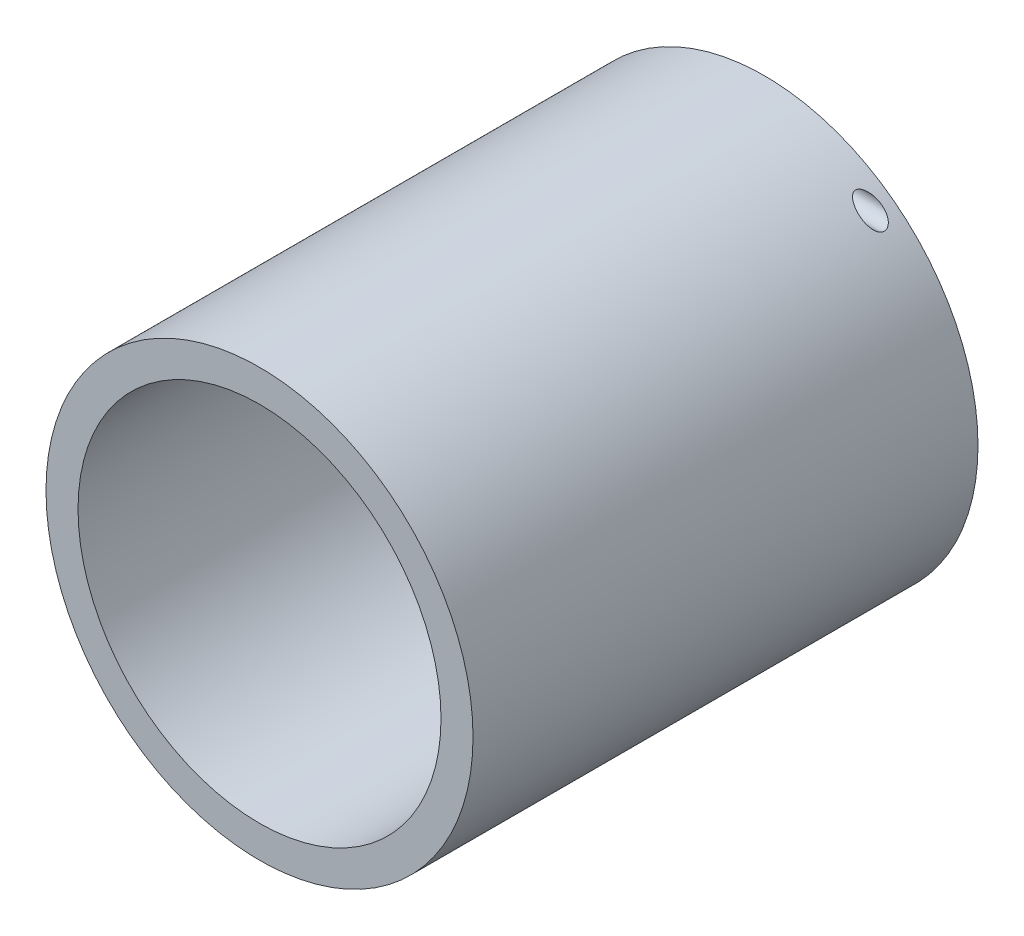
ISO-10303-21;
HEADER;
FILE_DESCRIPTION(('STEP AP214'),'2;1');
FILE_NAME('part.step','',(''),(''),'','','');
FILE_SCHEMA(('AUTOMOTIVE_DESIGN { 1 0 10303 214 1 1 1 1 }'));
ENDSEC;
DATA;
#1=APPLICATION_CONTEXT('core data for automotive mechanical design processes');
#2=APPLICATION_PROTOCOL_DEFINITION('international standard','automotive_design',2000,#1);
#3=PRODUCT_CONTEXT('',#1,'mechanical');
#4=PRODUCT('Part','Part','',(#3));
#5=PRODUCT_RELATED_PRODUCT_CATEGORY('part','',(#4));
#6=PRODUCT_DEFINITION_FORMATION('','',#4);
#7=PRODUCT_DEFINITION_CONTEXT('part definition',#1,'design');
#8=PRODUCT_DEFINITION('design','',#6,#7);
#9=PRODUCT_DEFINITION_SHAPE('','',#8);
#10=(LENGTH_UNIT() NAMED_UNIT(*) SI_UNIT(.MILLI.,.METRE.));
#11=(NAMED_UNIT(*) PLANE_ANGLE_UNIT() SI_UNIT($,.RADIAN.));
#12=(NAMED_UNIT(*) SI_UNIT($,.STERADIAN.) SOLID_ANGLE_UNIT());
#13=UNCERTAINTY_MEASURE_WITH_UNIT(LENGTH_MEASURE(1.E-05),#10,'distance_accuracy_value','');
#14=(GEOMETRIC_REPRESENTATION_CONTEXT(3) GLOBAL_UNCERTAINTY_ASSIGNED_CONTEXT((#13)) GLOBAL_UNIT_ASSIGNED_CONTEXT((#10,
#11,#12)) REPRESENTATION_CONTEXT('',''));
#15=CARTESIAN_POINT('',(0.,0.,0.));
#16=DIRECTION('',(0.,0.,1.));
#17=DIRECTION('',(1.,0.,0.));
#18=AXIS2_PLACEMENT_3D('',#15,#16,#17);
#19=CARTESIAN_POINT('',(0.,0.,25.4));
#20=DIRECTION('',(0.,0.,-1.));
#21=DIRECTION('',(-1.,0.,0.));
#22=AXIS2_PLACEMENT_3D('',#19,#20,#21);
#23=CYLINDRICAL_SURFACE('',#22,31.75);
#24=CARTESIAN_POINT('',(0.,0.,25.4));
#25=DIRECTION('',(0.,0.,1.));
#26=DIRECTION('',(1.,0.,0.));
#27=AXIS2_PLACEMENT_3D('',#24,#25,#26);
#28=CIRCLE('',#27,31.75);
#29=CARTESIAN_POINT('',(31.75,0.,25.4));
#30=VERTEX_POINT('',#29);
#31=EDGE_CURVE('E11',#30,#30,#28,.T.);
#32=ORIENTED_EDGE('',*,*,#31,.F.);
#33=EDGE_LOOP('',(#32));
#34=FACE_BOUND('',#33,.T.);
#35=CARTESIAN_POINT('',(0.,0.,-49.6911432191959));
#36=DIRECTION('',(0.,0.,1.));
#37=DIRECTION('',(1.,0.,0.));
#38=AXIS2_PLACEMENT_3D('',#35,#36,#37);
#39=CIRCLE('',#38,31.75);
#40=CARTESIAN_POINT('',(31.75,0.,-49.6911432191959));
#41=VERTEX_POINT('',#40);
#42=EDGE_CURVE('E56',#41,#41,#39,.T.);
#43=ORIENTED_EDGE('',*,*,#42,.T.);
#44=EDGE_LOOP('',(#43));
#45=FACE_BOUND('',#44,.T.);
#46=CARTESIAN_POINT('',(19.05,25.4,-44.9286432191959));
#47=CARTESIAN_POINT('',(18.9495516371161,25.4753369883196,-44.9286468655738));
#48=CARTESIAN_POINT('',(18.848681082069,25.5500564251826,-44.9339915155748));
#49=CARTESIAN_POINT('',(18.6467045433739,25.697831890246,-44.9550448434487));
#50=CARTESIAN_POINT('',(18.5455984619241,25.7708869972538,-44.9707591232486));
#51=CARTESIAN_POINT('',(18.3440851216914,25.9147129810374,-45.0125376984772));
#52=CARTESIAN_POINT('',(18.2436771670813,25.9854865068024,-45.0385894866572));
#53=CARTESIAN_POINT('',(18.0444009884585,26.124257148375,-45.101431998168));
#54=CARTESIAN_POINT('',(17.9455315937751,26.1922564460943,-45.1382140890692));
#55=CARTESIAN_POINT('',(17.7517142426591,26.3239947703776,-45.2229101370919));
#56=CARTESIAN_POINT('',(17.65673282193,26.3877762399617,-45.2706800698782));
#57=CARTESIAN_POINT('',(17.4712908225289,26.5109189701114,-45.3791489368652));
#58=CARTESIAN_POINT('',(17.3808272337477,26.57028318705,-45.4398391168509));
#59=CARTESIAN_POINT('',(17.2276912740188,26.669748665903,-45.5608751812851));
#60=CARTESIAN_POINT('',(17.1634094291122,26.7111417964148,-45.6180957688443));
#61=CARTESIAN_POINT('',(17.0423204686266,26.7885595335087,-45.7431916359237));
#62=CARTESIAN_POINT('',(16.9854964096642,26.8245963347655,-45.8110419676899));
#63=CARTESIAN_POINT('',(16.9032026941599,26.876488907564,-45.9307935883172));
#64=CARTESIAN_POINT('',(16.873999302278,26.8948246468494,-45.979031996372));
#65=CARTESIAN_POINT('',(16.8220020202817,26.9273779732704,-46.0801581722179));
#66=CARTESIAN_POINT('',(16.7991988026889,26.9416015542977,-46.1330390249881));
#67=CARTESIAN_POINT('',(16.7649428544738,26.9629289150886,-46.2339673453729));
#68=CARTESIAN_POINT('',(16.752254485087,26.9708098451117,-46.2814244120452));
#69=CARTESIAN_POINT('',(16.733835995549,26.9822414528819,-46.3781791530451));
#70=CARTESIAN_POINT('',(16.7280999280061,26.9857958318164,-46.4274752169207));
#71=CARTESIAN_POINT('',(16.7241541474286,26.9882414201881,-46.5266285332895));
#72=CARTESIAN_POINT('',(16.725965025851,26.9871198715925,-46.5764869504969));
#73=CARTESIAN_POINT('',(16.7369636367571,26.980299979863,-46.6750630117464));
#74=CARTESIAN_POINT('',(16.7461562444081,26.9745986120459,-46.7237798799765));
#75=CARTESIAN_POINT('',(16.7734084846001,26.957662479029,-46.8277830927563));
#76=CARTESIAN_POINT('',(16.7928140025632,26.9455865709297,-46.882574390636));
#77=CARTESIAN_POINT('',(16.8388693502475,26.9168295915097,-46.9877050654672));
#78=CARTESIAN_POINT('',(16.8655319965288,26.9001403719609,-47.0380363552984));
#79=CARTESIAN_POINT('',(16.9389929852281,26.8539699338507,-47.1580924423105));
#80=CARTESIAN_POINT('',(16.9891795690854,26.8222733506695,-47.2248654122673));
#81=CARTESIAN_POINT('',(17.097225164264,26.7535328726143,-47.3486948143335));
#82=CARTESIAN_POINT('',(17.1551026455265,26.716476085445,-47.4057270756346));
#83=CARTESIAN_POINT('',(17.2677796361902,26.6437643744208,-47.5042899650128));
#84=CARTESIAN_POINT('',(17.3219734130728,26.6085725323417,-47.5468732036572));
#85=CARTESIAN_POINT('',(17.4329966100935,26.5359667797702,-47.6263850748334));
#86=CARTESIAN_POINT('',(17.4898278868869,26.4985512985953,-47.6633096428303));
#87=CARTESIAN_POINT('',(17.6054323571269,26.4218862319575,-47.7321038936514));
#88=CARTESIAN_POINT('',(17.6642086632084,26.3826336604426,-47.7639649486469));
#89=CARTESIAN_POINT('',(17.7831002139828,26.3026422083356,-47.8229956174158));
#90=CARTESIAN_POINT('',(17.8432158574095,26.2619028827555,-47.850163812426));
#91=CARTESIAN_POINT('',(17.9979130530918,26.1562725140276,-47.9139449168181));
#92=CARTESIAN_POINT('',(18.0931659776745,26.0904868768172,-47.9474696629143));
#93=CARTESIAN_POINT('',(18.2849222711144,25.9564601555102,-48.0047051462892));
#94=CARTESIAN_POINT('',(18.3814263075014,25.8882177229227,-48.0284104017311));
#95=CARTESIAN_POINT('',(18.5749420111959,25.7497222117471,-48.0663067161071));
#96=CARTESIAN_POINT('',(18.6719539421651,25.6794679816365,-48.0804922078002));
#97=CARTESIAN_POINT('',(18.8657451578341,25.5374349536405,-48.0993038721156));
#98=CARTESIAN_POINT('',(18.9625245118699,25.4656566959924,-48.1039333768218));
#99=CARTESIAN_POINT('',(19.1399699248039,25.3324759429408,-48.1033732850198));
#100=CARTESIAN_POINT('',(19.2207601197431,25.2712308509418,-48.0996228552975));
#101=CARTESIAN_POINT('',(19.3813205724931,25.148302727145,-48.084785138767));
#102=CARTESIAN_POINT('',(19.4610910189521,25.0866197797307,-48.0736992296079));
#103=CARTESIAN_POINT('',(19.6189718125361,24.9633421499208,-48.0437238196701));
#104=CARTESIAN_POINT('',(19.697085276112,24.9017475518874,-48.0248506489507));
#105=CARTESIAN_POINT('',(19.8511582028389,24.7790982312867,-47.9786508340022));
#106=CARTESIAN_POINT('',(19.9271188381305,24.7180432278945,-47.9513288902626));
#107=CARTESIAN_POINT('',(20.0915423087147,24.5846660747633,-47.8807698669333));
#108=CARTESIAN_POINT('',(20.1793434619927,24.5126239268106,-47.8354103392349));
#109=CARTESIAN_POINT('',(20.3485568355601,24.3723359033058,-47.7293148781196));
#110=CARTESIAN_POINT('',(20.429975719781,24.30408609034,-47.6685952705027));
#111=CARTESIAN_POINT('',(20.5639778405702,24.1907216181726,-47.5471007154266));
#112=CARTESIAN_POINT('',(20.6186872152012,24.1440833154075,-47.4901194120848));
#113=CARTESIAN_POINT('',(20.7204746871386,24.0567848643916,-47.3656633491904));
#114=CARTESIAN_POINT('',(20.7675651723622,24.0161150219524,-47.2982059804974));
#115=CARTESIAN_POINT('',(20.841049563386,23.9523470116356,-47.170538062623));
#116=CARTESIAN_POINT('',(20.8696907444321,23.9273817882052,-47.1125653659923));
#117=CARTESIAN_POINT('',(20.9194660750028,23.883876010756,-46.9911897228817));
#118=CARTESIAN_POINT('',(20.9406051906555,23.8653312068239,-46.9277904032876));
#119=CARTESIAN_POINT('',(20.9740337738816,23.8359585105876,-46.7963195610956));
#120=CARTESIAN_POINT('',(20.9862461971806,23.825197809165,-46.7282127903174));
#121=CARTESIAN_POINT('',(21.0004097415401,23.812714855749,-46.5901308152664));
#122=CARTESIAN_POINT('',(21.0023685253931,23.8109858541502,-46.5201570455667));
#123=CARTESIAN_POINT('',(20.9962954239672,23.8163406508372,-46.3902774612735));
#124=CARTESIAN_POINT('',(20.9895429044842,23.8222959365402,-46.3302572437529));
#125=CARTESIAN_POINT('',(20.9686793854093,23.8406622415287,-46.2125461940749));
#126=CARTESIAN_POINT('',(20.9545672818978,23.8530742293033,-46.1548557127713));
#127=CARTESIAN_POINT('',(20.9195365466516,23.8838027995707,-46.0420242461661));
#128=CARTESIAN_POINT('',(20.8984962030415,23.902224907126,-45.9869506346127));
#129=CARTESIAN_POINT('',(20.8507773040995,23.9438633512666,-45.8812780612951));
#130=CARTESIAN_POINT('',(20.8240962750161,23.9670817912055,-45.8306810766339));
#131=CARTESIAN_POINT('',(20.7496159301177,24.0316359367889,-45.706814689394));
#132=CARTESIAN_POINT('',(20.6984382404335,24.0757634515682,-45.6370247072039));
#133=CARTESIAN_POINT('',(20.5879923659047,24.170279370951,-45.5090146960424));
#134=CARTESIAN_POINT('',(20.5287022426059,24.2206847183386,-45.4508271295366));
#135=CARTESIAN_POINT('',(20.3736733892808,24.3513978874226,-45.3190775453875));
#136=CARTESIAN_POINT('',(20.2744069001179,24.4341687849669,-45.2521373916485));
#137=CARTESIAN_POINT('',(20.0681816443467,24.6038322945919,-45.1389400760837));
#138=CARTESIAN_POINT('',(19.961213375963,24.6907299513267,-45.0927089889317));
#139=CARTESIAN_POINT('',(19.7230281388799,24.8815564609918,-45.01150138282));
#140=CARTESIAN_POINT('',(19.5908778049855,24.985769917776,-44.9799803474054));
#141=CARTESIAN_POINT('',(19.3227490660319,25.1937044112025,-44.9385345985268));
#142=CARTESIAN_POINT('',(19.1867658691094,25.297424623082,-44.9286382544555));
#143=CARTESIAN_POINT('',(19.05,25.4,-44.9286432191959));
#144=B_SPLINE_CURVE_WITH_KNOTS('',3,(#46,#47,#48,#49,#50,#51,#52,#53,#54,#55,#56,#57,#58,#59,
#60,#61,#62,#63,#64,#65,#66,#67,#68,#69,#70,#71,#72,#73,#74,#75,#76,#77,#78,#79,#80,#81,#82,#83,
#84,#85,#86,#87,#88,#89,#90,#91,#92,#93,#94,#95,#96,#97,#98,#99,#100,#101,#102,#103,#104,#105,
#106,#107,#108,#109,#110,#111,#112,#113,#114,#115,#116,#117,#118,#119,#120,#121,#122,#123,#124,
#125,#126,#127,#128,#129,#130,#131,#132,#133,#134,#135,#136,#137,#138,#139,#140,#141,#142,#143),
.UNSPECIFIED.,.T.,.F.,(4,2,2,2,2,2,2,2,2,2,2,2,2,2,2,2,2,2,2,2,2,2,2,2,2,2,2,2,2,2,2,2,2,2,2,2,
2,2,2,2,2,2,2,2,2,2,2,2,4),(0.,0.376519721616362,0.753243015074086,1.12951189775347,
1.50547890644567,1.87677351210103,2.24781734034277,2.53360221254578,2.81872613439836,
2.99609828754081,3.17321058387505,3.32183903164784,3.47034024430835,3.61924689983887,
3.7682519798039,3.94537446602046,4.12281181480125,4.38934368693302,4.65652761968452,
4.88836526118416,5.12036865531981,5.35276322199546,5.58522792457533,5.94627732701433,
6.30752801842099,6.66898978871304,7.03032549933305,7.33442658430186,7.63847057338158,
7.94188019005139,8.2451213070396,8.6110500148698,8.9765914095634,9.25092991230137,
9.52481777209407,9.73198448840428,9.93901381002611,10.1478095115436,10.3564491526878,
10.5376644700951,10.7189069771818,10.903520383516,11.0882149215799,11.3779937510111,
11.6685723157799,12.1028137950215,12.5376004990308,13.0495811634489,13.5622330921142),.UNSPECIFIED.);
#145=CARTESIAN_POINT('',(19.05,25.4,-44.9286432191959));
#146=VERTEX_POINT('',#145);
#147=EDGE_CURVE('E54',#146,#146,#144,.T.);
#148=ORIENTED_EDGE('',*,*,#147,.T.);
#149=EDGE_LOOP('',(#148));
#150=FACE_BOUND('',#149,.T.);
#151=ADVANCED_FACE('F33',(#34,#45,#150),#23,.T.);
#152=CARTESIAN_POINT('',(0.,0.,25.4));
#153=DIRECTION('',(0.,0.,-1.));
#154=DIRECTION('',(-1.,0.,0.));
#155=AXIS2_PLACEMENT_3D('',#152,#153,#154);
#156=CYLINDRICAL_SURFACE('',#155,26.9875);
#157=CARTESIAN_POINT('',(0.,0.,25.4));
#158=DIRECTION('',(0.,0.,1.));
#159=DIRECTION('',(1.,0.,0.));
#160=AXIS2_PLACEMENT_3D('',#157,#158,#159);
#161=CIRCLE('',#160,26.9875);
#162=CARTESIAN_POINT('',(26.9875,0.,25.4));
#163=VERTEX_POINT('',#162);
#164=EDGE_CURVE('E46',#163,#163,#161,.T.);
#165=ORIENTED_EDGE('',*,*,#164,.T.);
#166=EDGE_LOOP('',(#165));
#167=FACE_BOUND('',#166,.T.);
#168=CARTESIAN_POINT('',(0.,0.,-49.6911432191959));
#169=DIRECTION('',(0.,0.,1.));
#170=DIRECTION('',(1.,0.,0.));
#171=AXIS2_PLACEMENT_3D('',#168,#169,#170);
#172=CIRCLE('',#171,26.9875);
#173=CARTESIAN_POINT('',(26.9875,0.,-49.6911432191959));
#174=VERTEX_POINT('',#173);
#175=EDGE_CURVE('E53',#174,#174,#172,.T.);
#176=ORIENTED_EDGE('',*,*,#175,.F.);
#177=EDGE_LOOP('',(#176));
#178=FACE_BOUND('',#177,.T.);
#179=CARTESIAN_POINT('',(0.,26.9875,-46.5161432191959));
#180=CARTESIAN_POINT('',(2.53980623886958E-08,26.9875,-46.5160493793048));
#181=CARTESIAN_POINT('',(0.000634309944537524,26.9874999917382,-46.5159555397264));
#182=CARTESIAN_POINT('',(0.00218388102170997,26.9874999427117,-46.5156778369399));
#183=CARTESIAN_POINT('',(0.00277916871520576,26.9874998782663,-46.515494535386));
#184=CARTESIAN_POINT('',(0.00537812483548465,26.9874994940643,-46.5147630786139));
#185=CARTESIAN_POINT('',(0.00783065731862439,26.987498921445,-46.5142133957675));
#186=CARTESIAN_POINT('',(0.0178671640994493,26.9874953231977,-46.511907555022));
#187=CARTESIAN_POINT('',(0.0248900430789285,26.9874896721997,-46.5101533360807));
#188=CARTESIAN_POINT('',(0.171779488927722,26.9873110451904,-46.4735505703185));
#189=CARTESIAN_POINT('',(0.318387908722513,26.9859926045344,-46.438681986968));
#190=CARTESIAN_POINT('',(0.601894985295198,26.9811609386012,-46.3705226892254));
#191=CARTESIAN_POINT('',(0.738943898527739,26.9777412562997,-46.3372266537249));
#192=CARTESIAN_POINT('',(1.03184413621325,26.9682051189467,-46.2664976970676));
#193=CARTESIAN_POINT('',(1.18781178801172,26.9617946112087,-46.2290928671299));
#194=CARTESIAN_POINT('',(1.50118964765601,26.9461816498685,-46.1542646441428));
#195=CARTESIAN_POINT('',(1.65859605241367,26.9369482279142,-46.1168458921838));
#196=CARTESIAN_POINT('',(1.92656522108943,26.9188731156355,-46.0536324002604));
#197=CARTESIAN_POINT('',(2.03711840558505,26.9107336380434,-46.0276945177936));
#198=CARTESIAN_POINT('',(2.25788837669875,26.8931095494749,-45.9762188804128));
#199=CARTESIAN_POINT('',(2.36810527781843,26.8836285635575,-45.9506802466862));
#200=CARTESIAN_POINT('',(2.69294429213866,26.853671288284,-45.8759677395862));
#201=CARTESIAN_POINT('',(2.90751558972894,26.8312903548182,-45.8273333074017));
#202=CARTESIAN_POINT('',(3.61831577533173,26.7485066087409,-45.6692541404143));
#203=CARTESIAN_POINT('',(4.11422457718843,26.6767814725109,-45.5638624915577));
#204=CARTESIAN_POINT('',(4.85930364666551,26.547631868881,-45.417331152204));
#205=CARTESIAN_POINT('',(5.10916721007418,26.5006872807084,-45.3701992079929));
#206=CARTESIAN_POINT('',(5.60832547336009,26.3995582346244,-45.2809963509327));
#207=CARTESIAN_POINT('',(5.85762022280605,26.3453744341472,-45.2389249791628));
#208=CARTESIAN_POINT('',(6.37655579418467,26.2248265347486,-45.1576360128706));
#209=CARTESIAN_POINT('',(6.64613340966609,26.1578197513628,-45.1189610698566));
#210=CARTESIAN_POINT('',(7.18420972761588,26.0151831687618,-45.0505490967323));
#211=CARTESIAN_POINT('',(7.45270825244731,25.9395520055396,-45.0208134831522));
#212=CARTESIAN_POINT('',(7.9871150239923,25.7800040961225,-44.9725518202679));
#213=CARTESIAN_POINT('',(8.25302930087845,25.6961210308093,-44.953982237919));
#214=CARTESIAN_POINT('',(8.7826219591129,25.519962490148,-44.9306861335361));
#215=CARTESIAN_POINT('',(9.04630138394391,25.4276911976323,-44.9259527506299));
#216=CARTESIAN_POINT('',(9.45047285284687,25.279174675284,-44.9323895997656));
#217=CARTESIAN_POINT('',(9.59211749373404,25.2257669884069,-44.9372730989694));
#218=CARTESIAN_POINT('',(9.87426551055824,25.116665985408,-44.9531576099521));
#219=CARTESIAN_POINT('',(10.0147683957731,25.0609717429516,-44.964161124194));
#220=CARTESIAN_POINT('',(10.2925456343779,24.9481636718974,-44.9932011397059));
#221=CARTESIAN_POINT('',(10.4298385245927,24.8910742217673,-45.0111534600369));
#222=CARTESIAN_POINT('',(10.7022929888971,24.7751481302956,-45.0554672449037));
#223=CARTESIAN_POINT('',(10.8374555071458,24.716312298286,-45.0818248676625));
#224=CARTESIAN_POINT('',(11.0465082878669,24.6232945211116,-45.131109158825));
#225=CARTESIAN_POINT('',(11.1214235695244,24.5895459738298,-45.1505226855167));
#226=CARTESIAN_POINT('',(11.2700558122769,24.5217793605231,-45.1930832450675));
#227=CARTESIAN_POINT('',(11.3437730003505,24.4877613474085,-45.2162295614567));
#228=CARTESIAN_POINT('',(11.4898230541248,24.4195746694996,-45.266851497279));
#229=CARTESIAN_POINT('',(11.5621532624902,24.3854058450727,-45.2943346454131));
#230=CARTESIAN_POINT('',(11.704788820769,24.3172638055438,-45.3542927551261));
#231=CARTESIAN_POINT('',(11.7750949553602,24.2832905188379,-45.3867657504744));
#232=CARTESIAN_POINT('',(11.9298110874209,24.2077230545649,-45.4662194455923));
#233=CARTESIAN_POINT('',(12.0134885895563,24.1662867347521,-45.5148074924995));
#234=CARTESIAN_POINT('',(12.1743717404563,24.0856358994722,-45.6232966137666));
#235=CARTESIAN_POINT('',(12.2515898933201,24.0464171412883,-45.6831750643465));
#236=CARTESIAN_POINT('',(12.3690480791556,23.9861306461696,-45.7926314715921));
#237=CARTESIAN_POINT('',(12.4124867908419,23.9636686201346,-45.8379729642079));
#238=CARTESIAN_POINT('',(12.493182302253,23.9216973289171,-45.9351338358782));
#239=CARTESIAN_POINT('',(12.5304480093547,23.9021838128002,-45.9869436885367));
#240=CARTESIAN_POINT('',(12.5878427209766,23.87199515458,-46.0834455899474));
#241=CARTESIAN_POINT('',(12.6099245572096,23.8603313800139,-46.1266517479643));
#242=CARTESIAN_POINT('',(12.6476586789558,23.840351152506,-46.2165365490866));
#243=CARTESIAN_POINT('',(12.6633173733137,23.8320313631901,-46.2632116757339));
#244=CARTESIAN_POINT('',(12.6868998555123,23.8194860482614,-46.3595842236444));
#245=CARTESIAN_POINT('',(12.6947426958481,23.8153033733106,-46.4093077246397));
#246=CARTESIAN_POINT('',(12.7014548420348,23.8117244114606,-46.5095224222335));
#247=CARTESIAN_POINT('',(12.7003305098961,23.8123247311323,-46.5600130491932));
#248=CARTESIAN_POINT('',(12.6901037555533,23.8177757963351,-46.6523111176091));
#249=CARTESIAN_POINT('',(12.6822045381098,23.8219854909292,-46.6942993629391));
#250=CARTESIAN_POINT('',(12.6607005888766,23.833421177406,-46.7763451259614));
#251=CARTESIAN_POINT('',(12.6470929931207,23.8406486833547,-46.8164016632279));
#252=CARTESIAN_POINT('',(12.6085193514824,23.8610779090216,-46.9098529124564));
#253=CARTESIAN_POINT('',(12.5811838953471,23.8755140834052,-46.9619937799751));
#254=CARTESIAN_POINT('',(12.5194993847783,23.907917395672,-47.0607165162513));
#255=CARTESIAN_POINT('',(12.4851340323511,23.925892734996,-47.1072850612325));
#256=CARTESIAN_POINT('',(12.3883102995201,23.976226517873,-47.2226249921544));
#257=CARTESIAN_POINT('',(12.3217334436637,24.0105442437192,-47.2870443196379));
#258=CARTESIAN_POINT('',(12.1806739242402,24.0824142694012,-47.4043236142396));
#259=CARTESIAN_POINT('',(12.1061687577274,24.1199757157935,-47.4571493015479));
#260=CARTESIAN_POINT('',(11.9534111626754,24.1960386151295,-47.5526207866059));
#261=CARTESIAN_POINT('',(11.8752391990154,24.234514910175,-47.5954179180926));
#262=CARTESIAN_POINT('',(11.7155385379728,24.3121207177833,-47.6736014067412));
#263=CARTESIAN_POINT('',(11.6340066261742,24.3512508335275,-47.7089804604917));
#264=CARTESIAN_POINT('',(11.4686154144395,24.4295802361368,-47.7735267501402));
#265=CARTESIAN_POINT('',(11.384756777958,24.468779500359,-47.8026957366467));
#266=CARTESIAN_POINT('',(11.2153245021544,24.5469011654275,-47.8557722483365));
#267=CARTESIAN_POINT('',(11.1297514780737,24.5858236590371,-47.8796816253964));
#268=CARTESIAN_POINT('',(10.9469235826768,24.6678175367162,-47.9255865927044));
#269=CARTESIAN_POINT('',(10.8494980961236,24.7108269166912,-47.9470091372697));
#270=CARTESIAN_POINT('',(10.6533417078273,24.7960261985288,-47.9850007590099));
#271=CARTESIAN_POINT('',(10.5546105038129,24.8382159048529,-48.0015686910424));
#272=CARTESIAN_POINT('',(10.2567071941194,24.9634030922262,-48.0449912873819));
#273=CARTESIAN_POINT('',(10.0559914042731,25.044944092527,-48.0655256742868));
#274=CARTESIAN_POINT('',(9.6485251827677,25.2047590569671,-48.0937080819937));
#275=CARTESIAN_POINT('',(9.44173013121383,25.2829542090129,-48.1011317592727));
#276=CARTESIAN_POINT('',(9.02638276077922,25.434197044172,-48.1050735658246));
#277=CARTESIAN_POINT('',(8.81783198721479,25.5072488124145,-48.1016004520919));
#278=CARTESIAN_POINT('',(8.35911141910779,25.6616386162051,-48.0842131294724));
#279=CARTESIAN_POINT('',(8.10864441489902,25.741871744075,-48.0684209320622));
#280=CARTESIAN_POINT('',(7.60622146754987,25.8947781793043,-48.0266488660024));
#281=CARTESIAN_POINT('',(7.3542651557582,25.9674495243075,-48.0006663611709));
#282=CARTESIAN_POINT('',(6.84845079642752,26.1054175498994,-47.9403026774701));
#283=CARTESIAN_POINT('',(6.59458921688609,26.1706891001157,-47.9058940632142));
#284=CARTESIAN_POINT('',(6.08603157399437,26.2936081062791,-47.8302303530961));
#285=CARTESIAN_POINT('',(5.83133541889991,26.3512546930948,-47.7889744779552));
#286=CARTESIAN_POINT('',(5.11028731599483,26.5035276749127,-47.6644332462057));
#287=CARTESIAN_POINT('',(4.64316902408829,26.5892882277674,-47.5746154652771));
#288=CARTESIAN_POINT('',(3.71238431399425,26.7350530741709,-47.3833728476021));
#289=CARTESIAN_POINT('',(3.24873052908078,26.795308139791,-47.2820740594258));
#290=CARTESIAN_POINT('',(2.59389783068219,26.8632397795029,-47.1336752913945));
#291=CARTESIAN_POINT('',(2.40299219101838,26.8809874027726,-47.0897734109221));
#292=CARTESIAN_POINT('',(2.11400030905701,26.904754990125,-47.0225558838988));
#293=CARTESIAN_POINT('',(2.01594760678808,26.9122795432792,-46.9996173069459));
#294=CARTESIAN_POINT('',(1.81955004658163,26.9262715400586,-46.9534472360011));
#295=CARTESIAN_POINT('',(1.72120510249117,26.9327361319903,-46.9302151272539));
#296=CARTESIAN_POINT('',(1.48248803570684,26.9471189404861,-46.8735787441608));
#297=CARTESIAN_POINT('',(1.34212707716114,26.9544766886071,-46.8400727489416));
#298=CARTESIAN_POINT('',(1.06268893379576,26.966924364293,-46.7731445100621));
#299=CARTESIAN_POINT('',(0.923615036616446,26.9720388350541,-46.7397255525166));
#300=CARTESIAN_POINT('',(0.662417251610852,26.9796551285882,-46.6765729355941));
#301=CARTESIAN_POINT('',(0.540189876401,26.9823903855449,-46.6468591645368));
#302=CARTESIAN_POINT('',(0.28737531434238,26.9862646523905,-46.5860559432988));
#303=CARTESIAN_POINT('',(0.156655258489049,26.9873294594054,-46.5549626082344));
#304=CARTESIAN_POINT('',(0.0248902381330315,26.9874896707106,-46.5221334058224));
#305=CARTESIAN_POINT('',(0.017869524406433,26.9874953212251,-46.5203794971475));
#306=CARTESIAN_POINT('',(0.00783344312615751,26.9874989206977,-46.5180737237435));
#307=CARTESIAN_POINT('',(0.00537976033195383,26.9874994937596,-46.5175238021705));
#308=CARTESIAN_POINT('',(0.00277983744072831,26.9874998782121,-46.5167920528815));
#309=CARTESIAN_POINT('',(0.00218439264912239,26.9874999426917,-46.5166086944471));
#310=CARTESIAN_POINT('',(0.000634359602655,26.9874999917363,-46.516330921668));
#311=CARTESIAN_POINT('',(-2.54010906391228E-08,26.9875,-46.5162370702756));
#312=CARTESIAN_POINT('',(0.,26.9875,-46.5161432191959));
#313=B_SPLINE_CURVE_WITH_KNOTS('',3,(#179,#180,#181,#182,#183,#184,#185,#186,#187,#188,#189,
#190,#191,#192,#193,#194,#195,#196,#197,#198,#199,#200,#201,#202,#203,#204,#205,#206,#207,#208,
#209,#210,#211,#212,#213,#214,#215,#216,#217,#218,#219,#220,#221,#222,#223,#224,#225,#226,#227,
#228,#229,#230,#231,#232,#233,#234,#235,#236,#237,#238,#239,#240,#241,#242,#243,#244,#245,#246,
#247,#248,#249,#250,#251,#252,#253,#254,#255,#256,#257,#258,#259,#260,#261,#262,#263,#264,#265,
#266,#267,#268,#269,#270,#271,#272,#273,#274,#275,#276,#277,#278,#279,#280,#281,#282,#283,#284,
#285,#286,#287,#288,#289,#290,#291,#292,#293,#294,#295,#296,#297,#298,#299,#300,#301,#302,#303,
#304,#305,#306,#307,#308,#309,#310,#311,#312),.UNSPECIFIED.,.T.,.F.,(4,2,2,2,2,2,2,2,2,2,2,2,2,
2,2,2,2,2,2,2,2,2,2,2,2,2,2,2,2,2,2,2,2,2,2,2,2,2,2,2,2,2,2,2,2,2,2,2,2,2,2,2,2,2,2,2,2,2,2,2,2,
2,2,2,2,2,4),(0.,0.0011905518740737,0.00353062243095909,0.0105186818102552,0.0328557522992832,
0.476580708274209,0.901854736482299,1.38271235777299,1.869046899644,2.21055045670177,
2.55114821857293,3.21454986019023,4.74952071221443,5.52510723070315,6.30062336157451,
7.14175674332819,7.98302334128784,8.82098845832428,9.65853798813044,10.1127960155292,
10.5672399249107,11.0163426120483,11.4652403231656,11.7184517146215,11.9716145625172,
12.2252218342976,12.4787294281431,12.7939431622534,13.1085318553539,13.3081184821267,
13.5074145568988,13.6565989422094,13.8056341109901,13.9561972523233,14.1066535819479,
14.2348818407608,14.3631745104147,14.5439946991026,14.7252389485292,15.0199518460126,
15.3155247424849,15.6062994748625,15.8973591567869,16.1883366804683,16.4792115881563,
16.8049571175129,17.1307794244128,17.7829805852989,18.4462375179814,19.1089615736809,
19.8990255156397,20.6892939781827,21.4821705871227,22.2751374943568,23.7241864155823,
25.1586371979086,25.748669775508,26.0516121418595,26.3553566184165,26.7889852869825,
27.2177435882593,27.5970097592033,27.9926892729704,28.0150224434887,28.0220135242547,
28.0243543314455,28.0255450252709),.UNSPECIFIED.);
#314=CARTESIAN_POINT('',(0.,26.9875,-46.5161432191959));
#315=VERTEX_POINT('',#314);
#316=EDGE_CURVE('E36',#315,#315,#313,.T.);
#317=ORIENTED_EDGE('',*,*,#316,.T.);
#318=EDGE_LOOP('',(#317));
#319=FACE_BOUND('',#318,.T.);
#320=ADVANCED_FACE('F74',(#167,#178,#319),#156,.F.);
#321=CARTESIAN_POINT('',(0.,0.,25.4));
#322=DIRECTION('',(0.,0.,1.));
#323=DIRECTION('',(1.,0.,0.));
#324=AXIS2_PLACEMENT_3D('',#321,#322,#323);
#325=PLANE('',#324);
#326=ORIENTED_EDGE('',*,*,#31,.T.);
#327=EDGE_LOOP('',(#326));
#328=FACE_BOUND('',#327,.T.);
#329=ORIENTED_EDGE('',*,*,#164,.F.);
#330=EDGE_LOOP('',(#329));
#331=FACE_BOUND('',#330,.T.);
#332=ADVANCED_FACE('F72',(#328,#331),#325,.T.);
#333=CARTESIAN_POINT('',(0.,0.,-49.6911432191959));
#334=DIRECTION('',(0.,0.,1.));
#335=DIRECTION('',(1.,0.,0.));
#336=AXIS2_PLACEMENT_3D('',#333,#334,#335);
#337=PLANE('',#336);
#338=ORIENTED_EDGE('',*,*,#175,.T.);
#339=EDGE_LOOP('',(#338));
#340=FACE_BOUND('',#339,.T.);
#341=ORIENTED_EDGE('',*,*,#42,.F.);
#342=EDGE_LOOP('',(#341));
#343=FACE_BOUND('',#342,.T.);
#344=ADVANCED_FACE('F70',(#340,#343),#337,.F.);
#345=CARTESIAN_POINT('',(31.751,25.4,-46.5161432191959));
#346=DIRECTION('',(-1.,0.,0.));
#347=DIRECTION('',(0.,0.,1.));
#348=AXIS2_PLACEMENT_3D('',#345,#346,#347);
#349=CYLINDRICAL_SURFACE('',#348,1.5875);
#350=ORIENTED_EDGE('',*,*,#316,.F.);
#351=EDGE_LOOP('',(#350));
#352=FACE_BOUND('',#351,.T.);
#353=ORIENTED_EDGE('',*,*,#147,.F.);
#354=EDGE_LOOP('',(#353));
#355=FACE_BOUND('',#354,.T.);
#356=ADVANCED_FACE('F50',(#352,#355),#349,.F.);
#357=CLOSED_SHELL('',(#151,#320,#332,#344,#356));
#358=MANIFOLD_SOLID_BREP('B2',#357);
#359=ADVANCED_BREP_SHAPE_REPRESENTATION('',(#18,#358),#14);
#360=SHAPE_DEFINITION_REPRESENTATION(#9,#359);
ENDSEC;
END-ISO-10303-21;
